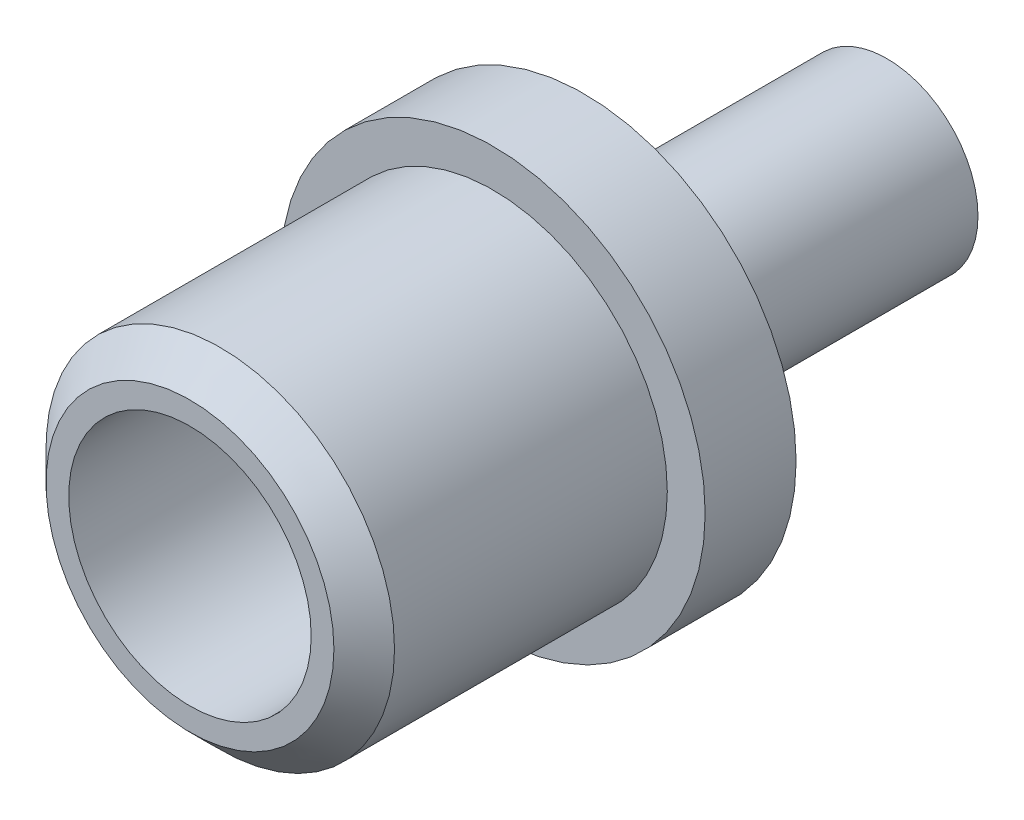
ISO-10303-21;
HEADER;
FILE_DESCRIPTION(('STEP AP214'),'2;1');
FILE_NAME('part.step','',(''),(''),'','','');
FILE_SCHEMA(('AUTOMOTIVE_DESIGN { 1 0 10303 214 1 1 1 1 }'));
ENDSEC;
DATA;
#1=APPLICATION_CONTEXT('core data for automotive mechanical design processes');
#2=APPLICATION_PROTOCOL_DEFINITION('international standard','automotive_design',2000,#1);
#3=PRODUCT_CONTEXT('',#1,'mechanical');
#4=PRODUCT('Part','Part','',(#3));
#5=PRODUCT_RELATED_PRODUCT_CATEGORY('part','',(#4));
#6=PRODUCT_DEFINITION_FORMATION('','',#4);
#7=PRODUCT_DEFINITION_CONTEXT('part definition',#1,'design');
#8=PRODUCT_DEFINITION('design','',#6,#7);
#9=PRODUCT_DEFINITION_SHAPE('','',#8);
#10=(LENGTH_UNIT() NAMED_UNIT(*) SI_UNIT(.MILLI.,.METRE.));
#11=(NAMED_UNIT(*) PLANE_ANGLE_UNIT() SI_UNIT($,.RADIAN.));
#12=(NAMED_UNIT(*) SI_UNIT($,.STERADIAN.) SOLID_ANGLE_UNIT());
#13=UNCERTAINTY_MEASURE_WITH_UNIT(LENGTH_MEASURE(1.E-05),#10,'distance_accuracy_value','');
#14=(GEOMETRIC_REPRESENTATION_CONTEXT(3) GLOBAL_UNCERTAINTY_ASSIGNED_CONTEXT((#13)) GLOBAL_UNIT_ASSIGNED_CONTEXT((#10,
#11,#12)) REPRESENTATION_CONTEXT('',''));
#15=CARTESIAN_POINT('',(0.,0.,0.));
#16=DIRECTION('',(0.,0.,1.));
#17=DIRECTION('',(1.,0.,0.));
#18=AXIS2_PLACEMENT_3D('',#15,#16,#17);
#19=CARTESIAN_POINT('',(0.,0.,10.));
#20=DIRECTION('',(0.,0.,-1.));
#21=DIRECTION('',(-1.,0.,0.));
#22=AXIS2_PLACEMENT_3D('',#19,#20,#21);
#23=CYLINDRICAL_SURFACE('',#22,4.);
#24=CARTESIAN_POINT('',(0.,0.,10.));
#25=DIRECTION('',(0.,0.,1.));
#26=DIRECTION('',(1.,0.,0.));
#27=AXIS2_PLACEMENT_3D('',#24,#25,#26);
#28=CIRCLE('',#27,4.);
#29=CARTESIAN_POINT('',(4.,0.,10.));
#30=VERTEX_POINT('',#29);
#31=EDGE_CURVE('E55',#30,#30,#28,.T.);
#32=ORIENTED_EDGE('',*,*,#31,.T.);
#33=EDGE_LOOP('',(#32));
#34=FACE_BOUND('',#33,.T.);
#35=CARTESIAN_POINT('',(0.,0.,0.));
#36=DIRECTION('',(0.,0.,1.));
#37=DIRECTION('',(1.,0.,0.));
#38=AXIS2_PLACEMENT_3D('',#35,#36,#37);
#39=CIRCLE('',#38,4.);
#40=CARTESIAN_POINT('',(4.,0.,0.));
#41=VERTEX_POINT('',#40);
#42=EDGE_CURVE('E58',#41,#41,#39,.T.);
#43=ORIENTED_EDGE('',*,*,#42,.F.);
#44=EDGE_LOOP('',(#43));
#45=FACE_BOUND('',#44,.T.);
#46=ADVANCED_FACE('F39',(#34,#45),#23,.F.);
#47=CARTESIAN_POINT('',(0.,0.,10.));
#48=DIRECTION('',(0.,0.,-1.));
#49=DIRECTION('',(-1.,0.,0.));
#50=AXIS2_PLACEMENT_3D('',#47,#48,#49);
#51=CYLINDRICAL_SURFACE('',#50,5.75);
#52=CARTESIAN_POINT('',(0.,0.,9.));
#53=DIRECTION('',(0.,0.,1.));
#54=DIRECTION('',(1.,0.,0.));
#55=AXIS2_PLACEMENT_3D('',#52,#53,#54);
#56=CIRCLE('',#55,5.75);
#57=CARTESIAN_POINT('',(5.75,0.,9.));
#58=VERTEX_POINT('',#57);
#59=EDGE_CURVE('E10',#58,#58,#56,.F.);
#60=ORIENTED_EDGE('',*,*,#59,.T.);
#61=EDGE_LOOP('',(#60));
#62=FACE_BOUND('',#61,.T.);
#63=CARTESIAN_POINT('',(0.,0.,0.));
#64=DIRECTION('',(0.,0.,1.));
#65=DIRECTION('',(1.,0.,0.));
#66=AXIS2_PLACEMENT_3D('',#63,#64,#65);
#67=CIRCLE('',#66,5.75);
#68=CARTESIAN_POINT('',(5.75,0.,0.));
#69=VERTEX_POINT('',#68);
#70=EDGE_CURVE('E76',#69,#69,#67,.T.);
#71=ORIENTED_EDGE('',*,*,#70,.T.);
#72=EDGE_LOOP('',(#71));
#73=FACE_BOUND('',#72,.T.);
#74=ADVANCED_FACE('F98',(#62,#73),#51,.T.);
#75=CARTESIAN_POINT('',(0.,0.,10.));
#76=DIRECTION('',(0.,0.,1.));
#77=DIRECTION('',(1.,0.,0.));
#78=AXIS2_PLACEMENT_3D('',#75,#76,#77);
#79=PLANE('',#78);
#80=CARTESIAN_POINT('',(0.,0.,10.));
#81=DIRECTION('',(0.,0.,1.));
#82=DIRECTION('',(1.,0.,0.));
#83=AXIS2_PLACEMENT_3D('',#80,#81,#82);
#84=CIRCLE('',#83,4.75);
#85=CARTESIAN_POINT('',(4.75,0.,10.));
#86=VERTEX_POINT('',#85);
#87=EDGE_CURVE('E47',#86,#86,#84,.T.);
#88=ORIENTED_EDGE('',*,*,#87,.T.);
#89=EDGE_LOOP('',(#88));
#90=FACE_BOUND('',#89,.T.);
#91=ORIENTED_EDGE('',*,*,#31,.F.);
#92=EDGE_LOOP('',(#91));
#93=FACE_BOUND('',#92,.T.);
#94=ADVANCED_FACE('F88',(#90,#93),#79,.T.);
#95=CARTESIAN_POINT('',(0.,0.,-3.));
#96=DIRECTION('',(0.,0.,1.));
#97=DIRECTION('',(1.,0.,0.));
#98=AXIS2_PLACEMENT_3D('',#95,#96,#97);
#99=PLANE('',#98);
#100=CARTESIAN_POINT('',(0.,0.,-3.));
#101=DIRECTION('',(0.,0.,1.));
#102=DIRECTION('',(1.,0.,0.));
#103=AXIS2_PLACEMENT_3D('',#100,#101,#102);
#104=CIRCLE('',#103,3.);
#105=CARTESIAN_POINT('',(3.,0.,-3.));
#106=VERTEX_POINT('',#105);
#107=EDGE_CURVE('E61',#106,#106,#104,.T.);
#108=ORIENTED_EDGE('',*,*,#107,.T.);
#109=EDGE_LOOP('',(#108));
#110=FACE_BOUND('',#109,.T.);
#111=CARTESIAN_POINT('',(0.,0.,-3.));
#112=DIRECTION('',(0.,0.,1.));
#113=DIRECTION('',(1.,0.,0.));
#114=AXIS2_PLACEMENT_3D('',#111,#112,#113);
#115=CIRCLE('',#114,7.);
#116=CARTESIAN_POINT('',(7.,0.,-3.));
#117=VERTEX_POINT('',#116);
#118=EDGE_CURVE('E72',#117,#117,#115,.T.);
#119=ORIENTED_EDGE('',*,*,#118,.F.);
#120=EDGE_LOOP('',(#119));
#121=FACE_BOUND('',#120,.T.);
#122=ADVANCED_FACE('F85',(#110,#121),#99,.F.);
#123=CARTESIAN_POINT('',(0.,0.,-13.));
#124=DIRECTION('',(0.,0.,1.));
#125=DIRECTION('',(1.,0.,0.));
#126=AXIS2_PLACEMENT_3D('',#123,#124,#125);
#127=CYLINDRICAL_SURFACE('',#126,3.);
#128=CARTESIAN_POINT('',(0.,0.,-13.));
#129=DIRECTION('',(0.,0.,1.));
#130=DIRECTION('',(1.,0.,0.));
#131=AXIS2_PLACEMENT_3D('',#128,#129,#130);
#132=CIRCLE('',#131,3.);
#133=CARTESIAN_POINT('',(3.,0.,-13.));
#134=VERTEX_POINT('',#133);
#135=EDGE_CURVE('E66',#134,#134,#132,.T.);
#136=CARTESIAN_POINT('',(3.,0.,-13.));
#137=CARTESIAN_POINT('',(3.,0.,-12.8958333333333));
#138=CARTESIAN_POINT('',(3.,0.,-12.7916666666667));
#139=CARTESIAN_POINT('',(3.,0.,-12.5833333333333));
#140=CARTESIAN_POINT('',(3.,0.,-12.4791666666667));
#141=CARTESIAN_POINT('',(3.,0.,-12.2708333333333));
#142=CARTESIAN_POINT('',(3.,0.,-12.1666666666667));
#143=CARTESIAN_POINT('',(3.,0.,-11.9583333333333));
#144=CARTESIAN_POINT('',(3.,0.,-11.8541666666667));
#145=CARTESIAN_POINT('',(3.,0.,-11.6458333333333));
#146=CARTESIAN_POINT('',(3.,0.,-11.5416666666667));
#147=CARTESIAN_POINT('',(3.,0.,-11.3333333333333));
#148=CARTESIAN_POINT('',(3.,0.,-11.2291666666667));
#149=CARTESIAN_POINT('',(3.,0.,-11.0208333333333));
#150=CARTESIAN_POINT('',(3.,0.,-10.9166666666667));
#151=CARTESIAN_POINT('',(3.,0.,-10.7083333333333));
#152=CARTESIAN_POINT('',(3.,0.,-10.6041666666667));
#153=CARTESIAN_POINT('',(3.,0.,-10.3958333333333));
#154=CARTESIAN_POINT('',(3.,0.,-10.2916666666667));
#155=CARTESIAN_POINT('',(3.,0.,-10.0833333333333));
#156=CARTESIAN_POINT('',(3.,0.,-9.97916666666667));
#157=CARTESIAN_POINT('',(3.,0.,-9.77083333333333));
#158=CARTESIAN_POINT('',(3.,0.,-9.66666666666667));
#159=CARTESIAN_POINT('',(3.,0.,-9.45833333333333));
#160=CARTESIAN_POINT('',(3.,0.,-9.35416666666667));
#161=CARTESIAN_POINT('',(3.,0.,-9.14583333333333));
#162=CARTESIAN_POINT('',(3.,0.,-9.04166666666667));
#163=CARTESIAN_POINT('',(3.,0.,-8.83333333333333));
#164=CARTESIAN_POINT('',(3.,0.,-8.72916666666667));
#165=CARTESIAN_POINT('',(3.,0.,-8.52083333333333));
#166=CARTESIAN_POINT('',(3.,0.,-8.41666666666667));
#167=CARTESIAN_POINT('',(3.,0.,-8.20833333333333));
#168=CARTESIAN_POINT('',(3.,0.,-8.10416666666667));
#169=CARTESIAN_POINT('',(3.,0.,-7.89583333333333));
#170=CARTESIAN_POINT('',(3.,0.,-7.79166666666667));
#171=CARTESIAN_POINT('',(3.,0.,-7.58333333333333));
#172=CARTESIAN_POINT('',(3.,0.,-7.47916666666667));
#173=CARTESIAN_POINT('',(3.,0.,-7.27083333333333));
#174=CARTESIAN_POINT('',(3.,0.,-7.16666666666667));
#175=CARTESIAN_POINT('',(3.,0.,-6.95833333333333));
#176=CARTESIAN_POINT('',(3.,0.,-6.85416666666667));
#177=CARTESIAN_POINT('',(3.,0.,-6.64583333333333));
#178=CARTESIAN_POINT('',(3.,0.,-6.54166666666667));
#179=CARTESIAN_POINT('',(3.,0.,-6.33333333333333));
#180=CARTESIAN_POINT('',(3.,0.,-6.22916666666667));
#181=CARTESIAN_POINT('',(3.,0.,-6.02083333333333));
#182=CARTESIAN_POINT('',(3.,0.,-5.91666666666667));
#183=CARTESIAN_POINT('',(3.,0.,-5.70833333333333));
#184=CARTESIAN_POINT('',(3.,0.,-5.60416666666667));
#185=CARTESIAN_POINT('',(3.,0.,-5.39583333333333));
#186=CARTESIAN_POINT('',(3.,0.,-5.29166666666667));
#187=CARTESIAN_POINT('',(3.,0.,-5.08333333333333));
#188=CARTESIAN_POINT('',(3.,0.,-4.97916666666667));
#189=CARTESIAN_POINT('',(3.,0.,-4.77083333333334));
#190=CARTESIAN_POINT('',(3.,0.,-4.66666666666667));
#191=CARTESIAN_POINT('',(3.,0.,-4.45833333333334));
#192=CARTESIAN_POINT('',(3.,0.,-4.35416666666667));
#193=CARTESIAN_POINT('',(3.,0.,-4.14583333333334));
#194=CARTESIAN_POINT('',(3.,0.,-4.04166666666667));
#195=CARTESIAN_POINT('',(3.,0.,-3.83333333333334));
#196=CARTESIAN_POINT('',(3.,0.,-3.72916666666667));
#197=CARTESIAN_POINT('',(3.,0.,-3.52083333333334));
#198=CARTESIAN_POINT('',(3.,0.,-3.41666666666667));
#199=CARTESIAN_POINT('',(3.,0.,-3.20833333333334));
#200=CARTESIAN_POINT('',(3.,0.,-3.10416666666667));
#201=CARTESIAN_POINT('',(3.,0.,-3.));
#202=B_SPLINE_CURVE_WITH_KNOTS('',3,(#136,#137,#138,#139,#140,#141,#142,#143,#144,#145,#146,
#147,#148,#149,#150,#151,#152,#153,#154,#155,#156,#157,#158,#159,#160,#161,#162,#163,#164,#165,
#166,#167,#168,#169,#170,#171,#172,#173,#174,#175,#176,#177,#178,#179,#180,#181,#182,#183,#184,
#185,#186,#187,#188,#189,#190,#191,#192,#193,#194,#195,#196,#197,#198,#199,#200,#201),
.UNSPECIFIED.,.F.,.F.,(4,2,2,2,2,2,2,2,2,2,2,2,2,2,2,2,2,2,2,2,2,2,2,2,2,2,2,2,2,2,2,2,4),(0.,
0.3125,0.625000000000001,0.937500000000001,1.25,1.5625,1.875,2.1875,2.5,2.8125,3.125,3.4375,
3.75,4.0625,4.375,4.6875,5.,5.3125,5.625,5.9375,6.25,6.5625,6.875,7.1875,7.5,7.8125,8.125,
8.4375,8.75,9.0625,9.375,9.6875,10.),.UNSPECIFIED.);
#203=EDGE_CURVE('BSEAM87',#134,#106,#202,.T.);
#204=ORIENTED_EDGE('',*,*,#135,.T.);
#205=ORIENTED_EDGE('',*,*,#107,.F.);
#206=ORIENTED_EDGE('',*,*,#203,.T.);
#207=ORIENTED_EDGE('',*,*,#203,.F.);
#208=EDGE_LOOP('',(#204,#206,#205,#207));
#209=FACE_BOUND('',#208,.T.);
#210=ADVANCED_FACE('F87',(#209),#127,.T.);
#211=CARTESIAN_POINT('',(0.,0.,-13.));
#212=DIRECTION('',(0.,0.,1.));
#213=DIRECTION('',(1.,0.,0.));
#214=AXIS2_PLACEMENT_3D('',#211,#212,#213);
#215=CYLINDRICAL_SURFACE('',#214,2.);
#216=CARTESIAN_POINT('',(0.,0.,-6.));
#217=DIRECTION('',(0.,0.,1.));
#218=DIRECTION('',(1.,0.,0.));
#219=AXIS2_PLACEMENT_3D('',#216,#217,#218);
#220=CIRCLE('',#219,2.);
#221=CARTESIAN_POINT('',(2.,0.,-6.));
#222=VERTEX_POINT('',#221);
#223=EDGE_CURVE('E51',#222,#222,#220,.T.);
#224=CARTESIAN_POINT('',(0.,0.,-13.));
#225=DIRECTION('',(0.,0.,1.));
#226=DIRECTION('',(1.,0.,0.));
#227=AXIS2_PLACEMENT_3D('',#224,#225,#226);
#228=CIRCLE('',#227,2.);
#229=CARTESIAN_POINT('',(2.,0.,-13.));
#230=VERTEX_POINT('',#229);
#231=EDGE_CURVE('E69',#230,#230,#228,.T.);
#232=CARTESIAN_POINT('',(2.,0.,-6.));
#233=CARTESIAN_POINT('',(2.,0.,-6.07291666666667));
#234=CARTESIAN_POINT('',(2.,0.,-6.14583333333334));
#235=CARTESIAN_POINT('',(2.,0.,-6.29166666666667));
#236=CARTESIAN_POINT('',(2.,0.,-6.36458333333334));
#237=CARTESIAN_POINT('',(2.,0.,-6.51041666666667));
#238=CARTESIAN_POINT('',(2.,0.,-6.58333333333334));
#239=CARTESIAN_POINT('',(2.,0.,-6.72916666666667));
#240=CARTESIAN_POINT('',(2.,0.,-6.80208333333334));
#241=CARTESIAN_POINT('',(2.,0.,-6.94791666666667));
#242=CARTESIAN_POINT('',(2.,0.,-7.02083333333334));
#243=CARTESIAN_POINT('',(2.,0.,-7.16666666666667));
#244=CARTESIAN_POINT('',(2.,0.,-7.23958333333334));
#245=CARTESIAN_POINT('',(2.,0.,-7.38541666666667));
#246=CARTESIAN_POINT('',(2.,0.,-7.45833333333334));
#247=CARTESIAN_POINT('',(2.,0.,-7.60416666666667));
#248=CARTESIAN_POINT('',(2.,0.,-7.67708333333334));
#249=CARTESIAN_POINT('',(2.,0.,-7.82291666666667));
#250=CARTESIAN_POINT('',(2.,0.,-7.89583333333334));
#251=CARTESIAN_POINT('',(2.,0.,-8.04166666666667));
#252=CARTESIAN_POINT('',(2.,0.,-8.11458333333334));
#253=CARTESIAN_POINT('',(2.,0.,-8.26041666666667));
#254=CARTESIAN_POINT('',(2.,0.,-8.33333333333334));
#255=CARTESIAN_POINT('',(2.,0.,-8.47916666666667));
#256=CARTESIAN_POINT('',(2.,0.,-8.55208333333334));
#257=CARTESIAN_POINT('',(2.,0.,-8.69791666666667));
#258=CARTESIAN_POINT('',(2.,0.,-8.77083333333333));
#259=CARTESIAN_POINT('',(2.,0.,-8.91666666666667));
#260=CARTESIAN_POINT('',(2.,0.,-8.98958333333333));
#261=CARTESIAN_POINT('',(2.,0.,-9.13541666666667));
#262=CARTESIAN_POINT('',(2.,0.,-9.20833333333333));
#263=CARTESIAN_POINT('',(2.,0.,-9.35416666666667));
#264=CARTESIAN_POINT('',(2.,0.,-9.42708333333333));
#265=CARTESIAN_POINT('',(2.,0.,-9.57291666666667));
#266=CARTESIAN_POINT('',(2.,0.,-9.64583333333333));
#267=CARTESIAN_POINT('',(2.,0.,-9.79166666666667));
#268=CARTESIAN_POINT('',(2.,0.,-9.86458333333333));
#269=CARTESIAN_POINT('',(2.,0.,-10.0104166666667));
#270=CARTESIAN_POINT('',(2.,0.,-10.0833333333333));
#271=CARTESIAN_POINT('',(2.,0.,-10.2291666666667));
#272=CARTESIAN_POINT('',(2.,0.,-10.3020833333333));
#273=CARTESIAN_POINT('',(2.,0.,-10.4479166666667));
#274=CARTESIAN_POINT('',(2.,0.,-10.5208333333333));
#275=CARTESIAN_POINT('',(2.,0.,-10.6666666666667));
#276=CARTESIAN_POINT('',(2.,0.,-10.7395833333333));
#277=CARTESIAN_POINT('',(2.,0.,-10.8854166666667));
#278=CARTESIAN_POINT('',(2.,0.,-10.9583333333333));
#279=CARTESIAN_POINT('',(2.,0.,-11.1041666666667));
#280=CARTESIAN_POINT('',(2.,0.,-11.1770833333333));
#281=CARTESIAN_POINT('',(2.,0.,-11.3229166666667));
#282=CARTESIAN_POINT('',(2.,0.,-11.3958333333333));
#283=CARTESIAN_POINT('',(2.,0.,-11.5416666666667));
#284=CARTESIAN_POINT('',(2.,0.,-11.6145833333333));
#285=CARTESIAN_POINT('',(2.,0.,-11.7604166666667));
#286=CARTESIAN_POINT('',(2.,0.,-11.8333333333333));
#287=CARTESIAN_POINT('',(2.,0.,-11.9791666666667));
#288=CARTESIAN_POINT('',(2.,0.,-12.0520833333333));
#289=CARTESIAN_POINT('',(2.,0.,-12.1979166666667));
#290=CARTESIAN_POINT('',(2.,0.,-12.2708333333333));
#291=CARTESIAN_POINT('',(2.,0.,-12.4166666666667));
#292=CARTESIAN_POINT('',(2.,0.,-12.4895833333333));
#293=CARTESIAN_POINT('',(2.,0.,-12.6354166666667));
#294=CARTESIAN_POINT('',(2.,0.,-12.7083333333333));
#295=CARTESIAN_POINT('',(2.,0.,-12.8541666666667));
#296=CARTESIAN_POINT('',(2.,0.,-12.9270833333333));
#297=CARTESIAN_POINT('',(2.,0.,-13.));
#298=B_SPLINE_CURVE_WITH_KNOTS('',3,(#232,#233,#234,#235,#236,#237,#238,#239,#240,#241,#242,
#243,#244,#245,#246,#247,#248,#249,#250,#251,#252,#253,#254,#255,#256,#257,#258,#259,#260,#261,
#262,#263,#264,#265,#266,#267,#268,#269,#270,#271,#272,#273,#274,#275,#276,#277,#278,#279,#280,
#281,#282,#283,#284,#285,#286,#287,#288,#289,#290,#291,#292,#293,#294,#295,#296,#297),
.UNSPECIFIED.,.F.,.F.,(4,2,2,2,2,2,2,2,2,2,2,2,2,2,2,2,2,2,2,2,2,2,2,2,2,2,2,2,2,2,2,2,4),(0.,
0.21875,0.4375,0.65625,0.875,1.09375,1.3125,1.53125,1.75,1.96875,2.1875,2.40625,2.625,2.84375,
3.0625,3.28125,3.5,3.71875,3.9375,4.15625,4.375,4.59375,4.8125,5.03125,5.25,5.46875,5.6875,
5.90625,6.125,6.34375,6.5625,6.78125,7.),.UNSPECIFIED.);
#299=EDGE_CURVE('BSEAM95',#222,#230,#298,.T.);
#300=ORIENTED_EDGE('',*,*,#223,.T.);
#301=ORIENTED_EDGE('',*,*,#231,.F.);
#302=ORIENTED_EDGE('',*,*,#299,.T.);
#303=ORIENTED_EDGE('',*,*,#299,.F.);
#304=EDGE_LOOP('',(#300,#302,#301,#303));
#305=FACE_BOUND('',#304,.T.);
#306=ADVANCED_FACE('F95',(#305),#215,.F.);
#307=CARTESIAN_POINT('',(0.,0.,-13.));
#308=DIRECTION('',(0.,0.,1.));
#309=DIRECTION('',(1.,0.,0.));
#310=AXIS2_PLACEMENT_3D('',#307,#308,#309);
#311=PLANE('',#310);
#312=ORIENTED_EDGE('',*,*,#231,.T.);
#313=EDGE_LOOP('',(#312));
#314=FACE_BOUND('',#313,.T.);
#315=ORIENTED_EDGE('',*,*,#135,.F.);
#316=EDGE_LOOP('',(#315));
#317=FACE_BOUND('',#316,.T.);
#318=ADVANCED_FACE('F126',(#314,#317),#311,.F.);
#319=CARTESIAN_POINT('',(0.,0.,-3.));
#320=DIRECTION('',(0.,0.,1.));
#321=DIRECTION('',(1.,0.,0.));
#322=AXIS2_PLACEMENT_3D('',#319,#320,#321);
#323=CYLINDRICAL_SURFACE('',#322,7.);
#324=ORIENTED_EDGE('',*,*,#118,.T.);
#325=EDGE_LOOP('',(#324));
#326=FACE_BOUND('',#325,.T.);
#327=CARTESIAN_POINT('',(0.,0.,0.));
#328=DIRECTION('',(0.,0.,1.));
#329=DIRECTION('',(1.,0.,0.));
#330=AXIS2_PLACEMENT_3D('',#327,#328,#329);
#331=CIRCLE('',#330,7.);
#332=CARTESIAN_POINT('',(7.,0.,0.));
#333=VERTEX_POINT('',#332);
#334=EDGE_CURVE('E73',#333,#333,#331,.T.);
#335=ORIENTED_EDGE('',*,*,#334,.F.);
#336=EDGE_LOOP('',(#335));
#337=FACE_BOUND('',#336,.T.);
#338=ADVANCED_FACE('F82',(#326,#337),#323,.T.);
#339=CARTESIAN_POINT('',(0.,0.,0.));
#340=DIRECTION('',(0.,0.,1.));
#341=DIRECTION('',(1.,0.,0.));
#342=AXIS2_PLACEMENT_3D('',#339,#340,#341);
#343=PLANE('',#342);
#344=ORIENTED_EDGE('',*,*,#70,.F.);
#345=EDGE_LOOP('',(#344));
#346=FACE_BOUND('',#345,.T.);
#347=ORIENTED_EDGE('',*,*,#334,.T.);
#348=EDGE_LOOP('',(#347));
#349=FACE_BOUND('',#348,.T.);
#350=ADVANCED_FACE('F111',(#346,#349),#343,.T.);
#351=CARTESIAN_POINT('',(0.,0.,-6.));
#352=DIRECTION('',(0.,0.,1.));
#353=DIRECTION('',(1.,0.,0.));
#354=AXIS2_PLACEMENT_3D('',#351,#352,#353);
#355=TOROIDAL_SURFACE('',#354,12.,10.);
#356=ORIENTED_EDGE('',*,*,#42,.T.);
#357=EDGE_LOOP('',(#356));
#358=FACE_BOUND('',#357,.T.);
#359=ORIENTED_EDGE('',*,*,#223,.F.);
#360=EDGE_LOOP('',(#359));
#361=FACE_BOUND('',#360,.T.);
#362=ADVANCED_FACE('F109',(#358,#361),#355,.T.);
#363=CARTESIAN_POINT('',(0.,0.,10.));
#364=DIRECTION('',(0.,0.,-1.));
#365=DIRECTION('',(-1.,0.,0.));
#366=AXIS2_PLACEMENT_3D('',#363,#364,#365);
#367=CONICAL_SURFACE('',#366,4.75,0.785398163397446);
#368=ORIENTED_EDGE('',*,*,#59,.F.);
#369=EDGE_LOOP('',(#368));
#370=FACE_BOUND('',#369,.T.);
#371=ORIENTED_EDGE('',*,*,#87,.F.);
#372=EDGE_LOOP('',(#371));
#373=FACE_BOUND('',#372,.T.);
#374=ADVANCED_FACE('F42',(#370,#373),#367,.T.);
#375=CLOSED_SHELL('',(#46,#74,#94,#122,#210,#306,#318,#338,#350,#362,#374));
#376=MANIFOLD_SOLID_BREP('B2',#375);
#377=ADVANCED_BREP_SHAPE_REPRESENTATION('',(#18,#376),#14);
#378=SHAPE_DEFINITION_REPRESENTATION(#9,#377);
ENDSEC;
END-ISO-10303-21;
